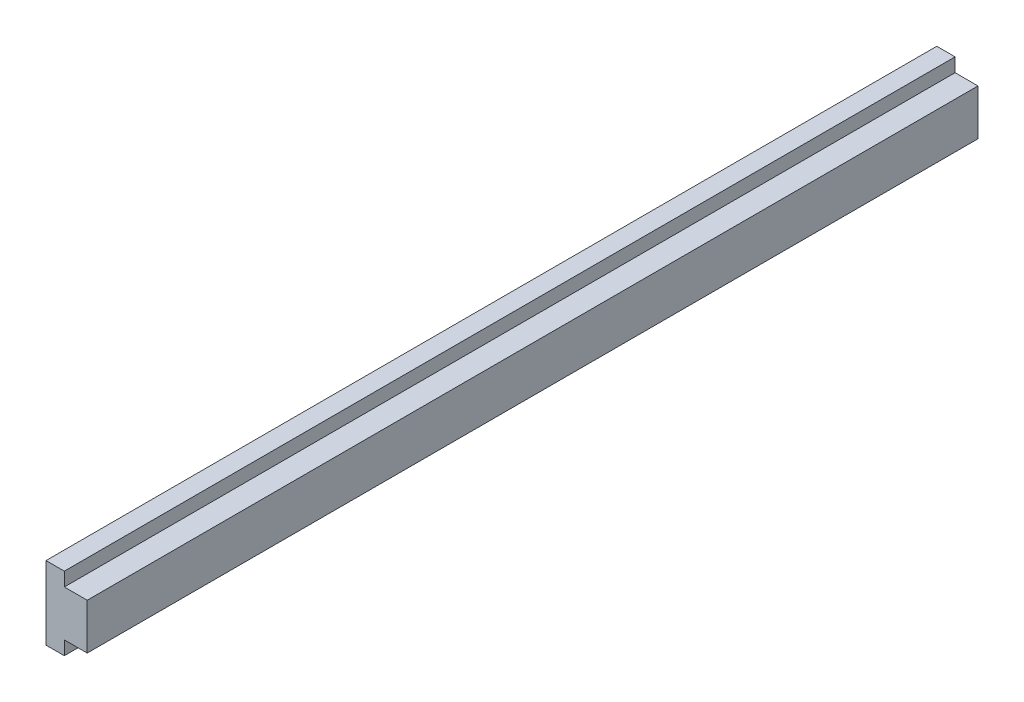
ISO-10303-21;
HEADER;
FILE_DESCRIPTION(('STEP AP214'),'2;1');
FILE_NAME('part.step','',(''),(''),'','','');
FILE_SCHEMA(('AUTOMOTIVE_DESIGN { 1 0 10303 214 1 1 1 1 }'));
ENDSEC;
DATA;
#1=APPLICATION_CONTEXT('core data for automotive mechanical design processes');
#2=APPLICATION_PROTOCOL_DEFINITION('international standard','automotive_design',2000,#1);
#3=PRODUCT_CONTEXT('',#1,'mechanical');
#4=PRODUCT('Part','Part','',(#3));
#5=PRODUCT_RELATED_PRODUCT_CATEGORY('part','',(#4));
#6=PRODUCT_DEFINITION_FORMATION('','',#4);
#7=PRODUCT_DEFINITION_CONTEXT('part definition',#1,'design');
#8=PRODUCT_DEFINITION('design','',#6,#7);
#9=PRODUCT_DEFINITION_SHAPE('','',#8);
#10=(LENGTH_UNIT() NAMED_UNIT(*) SI_UNIT(.MILLI.,.METRE.));
#11=(NAMED_UNIT(*) PLANE_ANGLE_UNIT() SI_UNIT($,.RADIAN.));
#12=(NAMED_UNIT(*) SI_UNIT($,.STERADIAN.) SOLID_ANGLE_UNIT());
#13=UNCERTAINTY_MEASURE_WITH_UNIT(LENGTH_MEASURE(1.E-05),#10,'distance_accuracy_value','');
#14=(GEOMETRIC_REPRESENTATION_CONTEXT(3) GLOBAL_UNCERTAINTY_ASSIGNED_CONTEXT((#13)) GLOBAL_UNIT_ASSIGNED_CONTEXT((#10,
#11,#12)) REPRESENTATION_CONTEXT('',''));
#15=CARTESIAN_POINT('',(0.,0.,0.));
#16=DIRECTION('',(0.,0.,1.));
#17=DIRECTION('',(1.,0.,0.));
#18=AXIS2_PLACEMENT_3D('',#15,#16,#17);
#19=CARTESIAN_POINT('',(0.,5.,-194.5));
#20=DIRECTION('',(0.,-1.,0.));
#21=DIRECTION('',(1.,0.,0.));
#22=AXIS2_PLACEMENT_3D('',#19,#20,#21);
#23=PLANE('',#22);
#24=DIRECTION('',(1.,0.,0.));
#25=VECTOR('',#24,1.);
#26=CARTESIAN_POINT('',(0.,5.,0.));
#27=LINE('',#26,#25);
#28=CARTESIAN_POINT('',(2.,5.,0.));
#29=VERTEX_POINT('',#28);
#30=CARTESIAN_POINT('',(7.,5.,0.));
#31=VERTEX_POINT('',#30);
#32=EDGE_CURVE('E169',#29,#31,#27,.T.);
#33=ORIENTED_EDGE('',*,*,#32,.T.);
#34=DIRECTION('',(0.,0.,1.));
#35=VECTOR('',#34,1.);
#36=CARTESIAN_POINT('',(7.,5.,-194.5));
#37=LINE('',#36,#35);
#38=CARTESIAN_POINT('',(7.,5.,-194.5));
#39=VERTEX_POINT('',#38);
#40=EDGE_CURVE('E11',#39,#31,#37,.T.);
#41=ORIENTED_EDGE('',*,*,#40,.F.);
#42=DIRECTION('',(1.,0.,0.));
#43=VECTOR('',#42,1.);
#44=CARTESIAN_POINT('',(0.,5.,-194.5));
#45=LINE('',#44,#43);
#46=CARTESIAN_POINT('',(2.,5.,-194.5));
#47=VERTEX_POINT('',#46);
#48=EDGE_CURVE('E68',#47,#39,#45,.T.);
#49=ORIENTED_EDGE('',*,*,#48,.F.);
#50=DIRECTION('',(0.,0.,1.));
#51=VECTOR('',#50,1.);
#52=CARTESIAN_POINT('',(2.,5.,-194.5));
#53=LINE('',#52,#51);
#54=EDGE_CURVE('E46',#47,#29,#53,.T.);
#55=ORIENTED_EDGE('',*,*,#54,.T.);
#56=EDGE_LOOP('',(#33,#41,#49,#55));
#57=FACE_BOUND('',#56,.T.);
#58=ADVANCED_FACE('F43',(#57),#23,.F.);
#59=CARTESIAN_POINT('',(7.,0.,-194.5));
#60=DIRECTION('',(1.,0.,0.));
#61=DIRECTION('',(0.,0.,-1.));
#62=AXIS2_PLACEMENT_3D('',#59,#60,#61);
#63=PLANE('',#62);
#64=DIRECTION('',(0.,1.,0.));
#65=VECTOR('',#64,1.);
#66=CARTESIAN_POINT('',(7.,0.,0.));
#67=LINE('',#66,#65);
#68=CARTESIAN_POINT('',(7.,-5.,0.));
#69=VERTEX_POINT('',#68);
#70=EDGE_CURVE('E154',#69,#31,#67,.T.);
#71=ORIENTED_EDGE('',*,*,#70,.F.);
#72=DIRECTION('',(0.,0.,1.));
#73=VECTOR('',#72,1.);
#74=CARTESIAN_POINT('',(7.,-5.,-194.5));
#75=LINE('',#74,#73);
#76=CARTESIAN_POINT('',(7.,-5.,-194.5));
#77=VERTEX_POINT('',#76);
#78=EDGE_CURVE('E51',#77,#69,#75,.T.);
#79=ORIENTED_EDGE('',*,*,#78,.F.);
#80=DIRECTION('',(0.,1.,0.));
#81=VECTOR('',#80,1.);
#82=CARTESIAN_POINT('',(7.,0.,-194.5));
#83=LINE('',#82,#81);
#84=EDGE_CURVE('E141',#77,#39,#83,.T.);
#85=ORIENTED_EDGE('',*,*,#84,.T.);
#86=ORIENTED_EDGE('',*,*,#40,.T.);
#87=EDGE_LOOP('',(#71,#79,#85,#86));
#88=FACE_BOUND('',#87,.T.);
#89=ADVANCED_FACE('F230',(#88),#63,.T.);
#90=CARTESIAN_POINT('',(0.,-5.,-194.5));
#91=DIRECTION('',(0.,-1.,0.));
#92=DIRECTION('',(1.,0.,0.));
#93=AXIS2_PLACEMENT_3D('',#90,#91,#92);
#94=PLANE('',#93);
#95=DIRECTION('',(1.,0.,0.));
#96=VECTOR('',#95,1.);
#97=CARTESIAN_POINT('',(0.,-5.,0.));
#98=LINE('',#97,#96);
#99=CARTESIAN_POINT('',(2.,-5.,0.));
#100=VERTEX_POINT('',#99);
#101=EDGE_CURVE('E131',#100,#69,#98,.T.);
#102=ORIENTED_EDGE('',*,*,#101,.F.);
#103=DIRECTION('',(0.,0.,1.));
#104=VECTOR('',#103,1.);
#105=CARTESIAN_POINT('',(2.,-5.,-194.5));
#106=LINE('',#105,#104);
#107=CARTESIAN_POINT('',(2.,-5.,-194.5));
#108=VERTEX_POINT('',#107);
#109=EDGE_CURVE('E126',#108,#100,#106,.T.);
#110=ORIENTED_EDGE('',*,*,#109,.F.);
#111=DIRECTION('',(1.,0.,0.));
#112=VECTOR('',#111,1.);
#113=CARTESIAN_POINT('',(0.,-5.,-194.5));
#114=LINE('',#113,#112);
#115=EDGE_CURVE('E129',#108,#77,#114,.T.);
#116=ORIENTED_EDGE('',*,*,#115,.T.);
#117=ORIENTED_EDGE('',*,*,#78,.T.);
#118=EDGE_LOOP('',(#102,#110,#116,#117));
#119=FACE_BOUND('',#118,.T.);
#120=ADVANCED_FACE('F128',(#119),#94,.T.);
#121=CARTESIAN_POINT('',(2.,0.,-194.5));
#122=DIRECTION('',(1.,0.,0.));
#123=DIRECTION('',(0.,0.,-1.));
#124=AXIS2_PLACEMENT_3D('',#121,#122,#123);
#125=PLANE('',#124);
#126=DIRECTION('',(0.,1.,0.));
#127=VECTOR('',#126,1.);
#128=CARTESIAN_POINT('',(2.,0.,0.));
#129=LINE('',#128,#127);
#130=CARTESIAN_POINT('',(2.,-8.,0.));
#131=VERTEX_POINT('',#130);
#132=EDGE_CURVE('E255',#131,#100,#129,.T.);
#133=ORIENTED_EDGE('',*,*,#132,.F.);
#134=DIRECTION('',(0.,0.,1.));
#135=VECTOR('',#134,1.);
#136=CARTESIAN_POINT('',(2.,-8.,-194.5));
#137=LINE('',#136,#135);
#138=CARTESIAN_POINT('',(2.,-8.,-194.5));
#139=VERTEX_POINT('',#138);
#140=EDGE_CURVE('E136',#139,#131,#137,.T.);
#141=ORIENTED_EDGE('',*,*,#140,.F.);
#142=DIRECTION('',(0.,1.,0.));
#143=VECTOR('',#142,1.);
#144=CARTESIAN_POINT('',(2.,0.,-194.5));
#145=LINE('',#144,#143);
#146=EDGE_CURVE('E140',#139,#108,#145,.T.);
#147=ORIENTED_EDGE('',*,*,#146,.T.);
#148=ORIENTED_EDGE('',*,*,#109,.T.);
#149=EDGE_LOOP('',(#133,#141,#147,#148));
#150=FACE_BOUND('',#149,.T.);
#151=ADVANCED_FACE('F143',(#150),#125,.T.);
#152=CARTESIAN_POINT('',(0.,-8.,-194.5));
#153=DIRECTION('',(0.,1.,0.));
#154=DIRECTION('',(0.,0.,1.));
#155=AXIS2_PLACEMENT_3D('',#152,#153,#154);
#156=PLANE('',#155);
#157=DIRECTION('',(-1.,0.,0.));
#158=VECTOR('',#157,1.);
#159=CARTESIAN_POINT('',(0.,-8.,0.));
#160=LINE('',#159,#158);
#161=CARTESIAN_POINT('',(-2.,-8.,0.));
#162=VERTEX_POINT('',#161);
#163=EDGE_CURVE('E261',#131,#162,#160,.T.);
#164=ORIENTED_EDGE('',*,*,#163,.T.);
#165=DIRECTION('',(0.,0.,1.));
#166=VECTOR('',#165,1.);
#167=CARTESIAN_POINT('',(-2.,-8.,-194.5));
#168=LINE('',#167,#166);
#169=CARTESIAN_POINT('',(-2.,-8.,-194.5));
#170=VERTEX_POINT('',#169);
#171=EDGE_CURVE('E245',#170,#162,#168,.T.);
#172=ORIENTED_EDGE('',*,*,#171,.F.);
#173=DIRECTION('',(-1.,0.,0.));
#174=VECTOR('',#173,1.);
#175=CARTESIAN_POINT('',(0.,-8.,-194.5));
#176=LINE('',#175,#174);
#177=EDGE_CURVE('E145',#139,#170,#176,.T.);
#178=ORIENTED_EDGE('',*,*,#177,.F.);
#179=ORIENTED_EDGE('',*,*,#140,.T.);
#180=EDGE_LOOP('',(#164,#172,#178,#179));
#181=FACE_BOUND('',#180,.T.);
#182=ADVANCED_FACE('F267',(#181),#156,.F.);
#183=CARTESIAN_POINT('',(-2.,0.,-194.5));
#184=DIRECTION('',(1.,0.,0.));
#185=DIRECTION('',(0.,0.,-1.));
#186=AXIS2_PLACEMENT_3D('',#183,#184,#185);
#187=PLANE('',#186);
#188=DIRECTION('',(0.,1.,0.));
#189=VECTOR('',#188,1.);
#190=CARTESIAN_POINT('',(-2.,0.,0.));
#191=LINE('',#190,#189);
#192=CARTESIAN_POINT('',(-2.,8.,0.));
#193=VERTEX_POINT('',#192);
#194=EDGE_CURVE('E258',#162,#193,#191,.T.);
#195=ORIENTED_EDGE('',*,*,#194,.T.);
#196=DIRECTION('',(0.,0.,1.));
#197=VECTOR('',#196,1.);
#198=CARTESIAN_POINT('',(-2.,8.,-194.5));
#199=LINE('',#198,#197);
#200=CARTESIAN_POINT('',(-2.,8.,-194.5));
#201=VERTEX_POINT('',#200);
#202=EDGE_CURVE('E248',#201,#193,#199,.T.);
#203=ORIENTED_EDGE('',*,*,#202,.F.);
#204=DIRECTION('',(0.,1.,0.));
#205=VECTOR('',#204,1.);
#206=CARTESIAN_POINT('',(-2.,0.,-194.5));
#207=LINE('',#206,#205);
#208=EDGE_CURVE('E148',#170,#201,#207,.T.);
#209=ORIENTED_EDGE('',*,*,#208,.F.);
#210=ORIENTED_EDGE('',*,*,#171,.T.);
#211=EDGE_LOOP('',(#195,#203,#209,#210));
#212=FACE_BOUND('',#211,.T.);
#213=ADVANCED_FACE('F270',(#212),#187,.F.);
#214=CARTESIAN_POINT('',(0.,8.,-194.5));
#215=DIRECTION('',(0.,1.,0.));
#216=DIRECTION('',(0.,0.,1.));
#217=AXIS2_PLACEMENT_3D('',#214,#215,#216);
#218=PLANE('',#217);
#219=DIRECTION('',(-1.,0.,0.));
#220=VECTOR('',#219,1.);
#221=CARTESIAN_POINT('',(0.,8.,0.));
#222=LINE('',#221,#220);
#223=CARTESIAN_POINT('',(2.,8.,0.));
#224=VERTEX_POINT('',#223);
#225=EDGE_CURVE('E254',#224,#193,#222,.T.);
#226=ORIENTED_EDGE('',*,*,#225,.F.);
#227=DIRECTION('',(0.,0.,1.));
#228=VECTOR('',#227,1.);
#229=CARTESIAN_POINT('',(2.,8.,-194.5));
#230=LINE('',#229,#228);
#231=CARTESIAN_POINT('',(2.,8.,-194.5));
#232=VERTEX_POINT('',#231);
#233=EDGE_CURVE('E249',#232,#224,#230,.T.);
#234=ORIENTED_EDGE('',*,*,#233,.F.);
#235=DIRECTION('',(-1.,0.,0.));
#236=VECTOR('',#235,1.);
#237=CARTESIAN_POINT('',(0.,8.,-194.5));
#238=LINE('',#237,#236);
#239=EDGE_CURVE('E152',#232,#201,#238,.T.);
#240=ORIENTED_EDGE('',*,*,#239,.T.);
#241=ORIENTED_EDGE('',*,*,#202,.T.);
#242=EDGE_LOOP('',(#226,#234,#240,#241));
#243=FACE_BOUND('',#242,.T.);
#244=ADVANCED_FACE('F275',(#243),#218,.T.);
#245=EDGE_CURVE('E239',#29,#224,#129,.T.);
#246=ORIENTED_EDGE('',*,*,#245,.F.);
#247=ORIENTED_EDGE('',*,*,#54,.F.);
#248=EDGE_CURVE('E147',#47,#232,#145,.T.);
#249=ORIENTED_EDGE('',*,*,#248,.T.);
#250=ORIENTED_EDGE('',*,*,#233,.T.);
#251=EDGE_LOOP('',(#246,#247,#249,#250));
#252=FACE_BOUND('',#251,.T.);
#253=ADVANCED_FACE('F276',(#252),#125,.T.);
#254=CARTESIAN_POINT('',(0.,0.,-194.5));
#255=DIRECTION('',(0.,0.,1.));
#256=DIRECTION('',(1.,0.,0.));
#257=AXIS2_PLACEMENT_3D('',#254,#255,#256);
#258=PLANE('',#257);
#259=DIRECTION('',(-1.,0.,0.));
#260=VECTOR('',#259,1.);
#261=CARTESIAN_POINT('',(-0.550000000000001,-3.05,-194.5));
#262=LINE('',#261,#260);
#263=CARTESIAN_POINT('',(5.55,-3.05,-194.5));
#264=VERTEX_POINT('',#263);
#265=CARTESIAN_POINT('',(-0.550000000000001,-3.05,-194.5));
#266=VERTEX_POINT('',#265);
#267=EDGE_CURVE('E177',#264,#266,#262,.T.);
#268=ORIENTED_EDGE('',*,*,#267,.F.);
#269=DIRECTION('',(0.,-1.,0.));
#270=VECTOR('',#269,1.);
#271=CARTESIAN_POINT('',(5.55,3.05,-194.5));
#272=LINE('',#271,#270);
#273=CARTESIAN_POINT('',(5.55,3.05,-194.5));
#274=VERTEX_POINT('',#273);
#275=EDGE_CURVE('E59',#274,#264,#272,.T.);
#276=ORIENTED_EDGE('',*,*,#275,.F.);
#277=DIRECTION('',(1.,0.,0.));
#278=VECTOR('',#277,1.);
#279=CARTESIAN_POINT('',(-0.55,3.05,-194.5));
#280=LINE('',#279,#278);
#281=CARTESIAN_POINT('',(-0.55,3.05,-194.5));
#282=VERTEX_POINT('',#281);
#283=EDGE_CURVE('E170',#282,#274,#280,.T.);
#284=ORIENTED_EDGE('',*,*,#283,.F.);
#285=DIRECTION('',(0.,1.,0.));
#286=VECTOR('',#285,1.);
#287=CARTESIAN_POINT('',(-0.55,3.05,-194.5));
#288=LINE('',#287,#286);
#289=EDGE_CURVE('E174',#266,#282,#288,.T.);
#290=ORIENTED_EDGE('',*,*,#289,.F.);
#291=EDGE_LOOP('',(#268,#276,#284,#290));
#292=FACE_BOUND('',#291,.T.);
#293=ORIENTED_EDGE('',*,*,#48,.T.);
#294=ORIENTED_EDGE('',*,*,#84,.F.);
#295=ORIENTED_EDGE('',*,*,#115,.F.);
#296=ORIENTED_EDGE('',*,*,#146,.F.);
#297=ORIENTED_EDGE('',*,*,#177,.T.);
#298=ORIENTED_EDGE('',*,*,#208,.T.);
#299=ORIENTED_EDGE('',*,*,#239,.F.);
#300=ORIENTED_EDGE('',*,*,#248,.F.);
#301=EDGE_LOOP('',(#293,#294,#295,#296,#297,#298,#299,#300));
#302=FACE_BOUND('',#301,.T.);
#303=ADVANCED_FACE('F139',(#292,#302),#258,.F.);
#304=CARTESIAN_POINT('',(0.,0.,0.));
#305=DIRECTION('',(0.,0.,1.));
#306=DIRECTION('',(1.,0.,0.));
#307=AXIS2_PLACEMENT_3D('',#304,#305,#306);
#308=PLANE('',#307);
#309=ORIENTED_EDGE('',*,*,#32,.F.);
#310=ORIENTED_EDGE('',*,*,#245,.T.);
#311=ORIENTED_EDGE('',*,*,#225,.T.);
#312=ORIENTED_EDGE('',*,*,#194,.F.);
#313=ORIENTED_EDGE('',*,*,#163,.F.);
#314=ORIENTED_EDGE('',*,*,#132,.T.);
#315=ORIENTED_EDGE('',*,*,#101,.T.);
#316=ORIENTED_EDGE('',*,*,#70,.T.);
#317=EDGE_LOOP('',(#309,#310,#311,#312,#313,#314,#315,#316));
#318=FACE_BOUND('',#317,.T.);
#319=ADVANCED_FACE('F241',(#318),#308,.T.);
#320=CARTESIAN_POINT('',(5.55,3.05,-174.5));
#321=DIRECTION('',(1.,0.,0.));
#322=DIRECTION('',(0.,0.,-1.));
#323=AXIS2_PLACEMENT_3D('',#320,#321,#322);
#324=PLANE('',#323);
#325=ORIENTED_EDGE('',*,*,#275,.T.);
#326=DIRECTION('',(0.,0.,-1.));
#327=VECTOR('',#326,1.);
#328=CARTESIAN_POINT('',(5.55,-3.05,-174.5));
#329=LINE('',#328,#327);
#330=CARTESIAN_POINT('',(5.55,-3.05,-174.5));
#331=VERTEX_POINT('',#330);
#332=EDGE_CURVE('E158',#331,#264,#329,.T.);
#333=ORIENTED_EDGE('',*,*,#332,.F.);
#334=DIRECTION('',(0.,-1.,0.));
#335=VECTOR('',#334,1.);
#336=CARTESIAN_POINT('',(5.55,3.05,-174.5));
#337=LINE('',#336,#335);
#338=CARTESIAN_POINT('',(5.55,3.05,-174.5));
#339=VERTEX_POINT('',#338);
#340=EDGE_CURVE('E173',#339,#331,#337,.T.);
#341=ORIENTED_EDGE('',*,*,#340,.F.);
#342=DIRECTION('',(0.,0.,-1.));
#343=VECTOR('',#342,1.);
#344=CARTESIAN_POINT('',(5.55,3.05,-174.5));
#345=LINE('',#344,#343);
#346=EDGE_CURVE('E167',#339,#274,#345,.T.);
#347=ORIENTED_EDGE('',*,*,#346,.T.);
#348=EDGE_LOOP('',(#325,#333,#341,#347));
#349=FACE_BOUND('',#348,.T.);
#350=ADVANCED_FACE('F198',(#349),#324,.F.);
#351=CARTESIAN_POINT('',(-0.55,3.05,-174.5));
#352=DIRECTION('',(0.,1.,0.));
#353=DIRECTION('',(0.,0.,1.));
#354=AXIS2_PLACEMENT_3D('',#351,#352,#353);
#355=PLANE('',#354);
#356=ORIENTED_EDGE('',*,*,#283,.T.);
#357=ORIENTED_EDGE('',*,*,#346,.F.);
#358=DIRECTION('',(1.,0.,0.));
#359=VECTOR('',#358,1.);
#360=CARTESIAN_POINT('',(-0.55,3.05,-174.5));
#361=LINE('',#360,#359);
#362=CARTESIAN_POINT('',(-0.55,3.05,-174.5));
#363=VERTEX_POINT('',#362);
#364=EDGE_CURVE('E161',#363,#339,#361,.T.);
#365=ORIENTED_EDGE('',*,*,#364,.F.);
#366=DIRECTION('',(0.,0.,-1.));
#367=VECTOR('',#366,1.);
#368=CARTESIAN_POINT('',(-0.55,3.05,-174.5));
#369=LINE('',#368,#367);
#370=EDGE_CURVE('E164',#363,#282,#369,.T.);
#371=ORIENTED_EDGE('',*,*,#370,.T.);
#372=EDGE_LOOP('',(#356,#357,#365,#371));
#373=FACE_BOUND('',#372,.T.);
#374=ADVANCED_FACE('F209',(#373),#355,.F.);
#375=CARTESIAN_POINT('',(-0.55,3.05,-174.5));
#376=DIRECTION('',(-1.,0.,0.));
#377=DIRECTION('',(0.,-1.,0.));
#378=AXIS2_PLACEMENT_3D('',#375,#376,#377);
#379=PLANE('',#378);
#380=ORIENTED_EDGE('',*,*,#289,.T.);
#381=ORIENTED_EDGE('',*,*,#370,.F.);
#382=DIRECTION('',(0.,1.,0.));
#383=VECTOR('',#382,1.);
#384=CARTESIAN_POINT('',(-0.55,3.05,-174.5));
#385=LINE('',#384,#383);
#386=CARTESIAN_POINT('',(-0.550000000000001,-3.05,-174.5));
#387=VERTEX_POINT('',#386);
#388=EDGE_CURVE('E183',#387,#363,#385,.T.);
#389=ORIENTED_EDGE('',*,*,#388,.F.);
#390=DIRECTION('',(0.,0.,-1.));
#391=VECTOR('',#390,1.);
#392=CARTESIAN_POINT('',(-0.550000000000001,-3.05,-174.5));
#393=LINE('',#392,#391);
#394=EDGE_CURVE('E160',#387,#266,#393,.T.);
#395=ORIENTED_EDGE('',*,*,#394,.T.);
#396=EDGE_LOOP('',(#380,#381,#389,#395));
#397=FACE_BOUND('',#396,.T.);
#398=ADVANCED_FACE('F214',(#397),#379,.F.);
#399=CARTESIAN_POINT('',(-0.550000000000001,-3.05,-174.5));
#400=DIRECTION('',(0.,-1.,0.));
#401=DIRECTION('',(0.,0.,-1.));
#402=AXIS2_PLACEMENT_3D('',#399,#400,#401);
#403=PLANE('',#402);
#404=ORIENTED_EDGE('',*,*,#267,.T.);
#405=ORIENTED_EDGE('',*,*,#394,.F.);
#406=DIRECTION('',(-1.,0.,0.));
#407=VECTOR('',#406,1.);
#408=CARTESIAN_POINT('',(-0.550000000000001,-3.05,-174.5));
#409=LINE('',#408,#407);
#410=EDGE_CURVE('E186',#331,#387,#409,.T.);
#411=ORIENTED_EDGE('',*,*,#410,.F.);
#412=ORIENTED_EDGE('',*,*,#332,.T.);
#413=EDGE_LOOP('',(#404,#405,#411,#412));
#414=FACE_BOUND('',#413,.T.);
#415=ADVANCED_FACE('F219',(#414),#403,.F.);
#416=CARTESIAN_POINT('',(0.,0.,-174.5));
#417=DIRECTION('',(0.,0.,1.));
#418=DIRECTION('',(1.,0.,0.));
#419=AXIS2_PLACEMENT_3D('',#416,#417,#418);
#420=PLANE('',#419);
#421=ORIENTED_EDGE('',*,*,#340,.T.);
#422=ORIENTED_EDGE('',*,*,#410,.T.);
#423=ORIENTED_EDGE('',*,*,#388,.T.);
#424=ORIENTED_EDGE('',*,*,#364,.T.);
#425=EDGE_LOOP('',(#421,#422,#423,#424));
#426=FACE_BOUND('',#425,.T.);
#427=ADVANCED_FACE('F193',(#426),#420,.F.);
#428=CLOSED_SHELL('',(#58,#89,#120,#151,#182,#213,#244,#253,#303,#319,#350,#374,#398,#415,#427));
#429=MANIFOLD_SOLID_BREP('B2',#428);
#430=ADVANCED_BREP_SHAPE_REPRESENTATION('',(#18,#429),#14);
#431=SHAPE_DEFINITION_REPRESENTATION(#9,#430);
ENDSEC;
END-ISO-10303-21;
